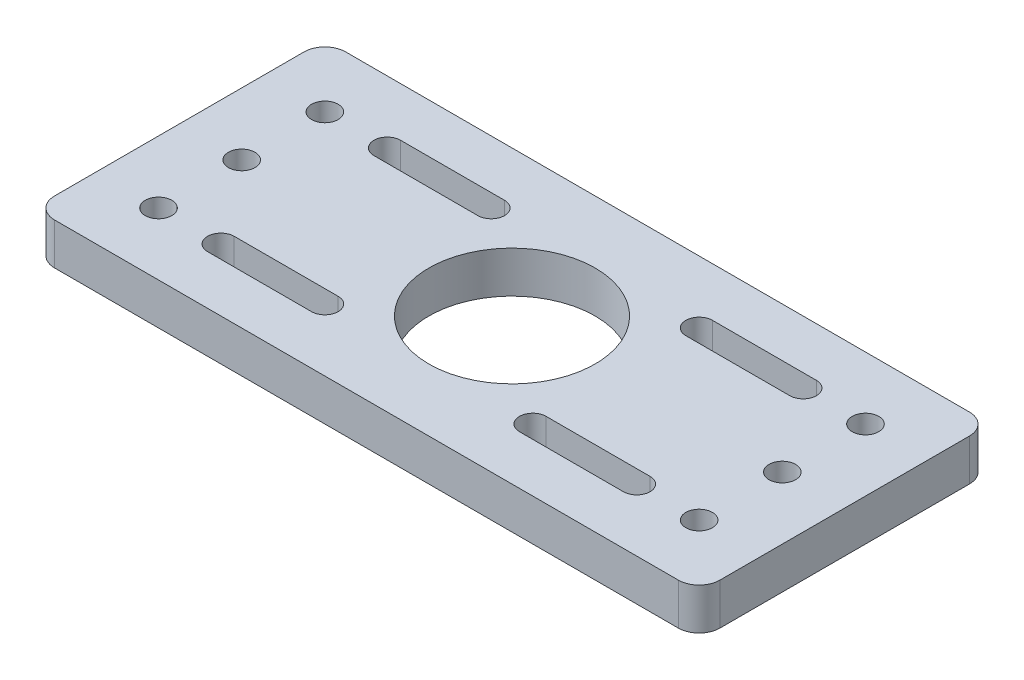
ISO-10303-21;
HEADER;
FILE_DESCRIPTION(('STEP AP214'),'2;1');
FILE_NAME('part.step','',(''),(''),'','','');
FILE_SCHEMA(('AUTOMOTIVE_DESIGN { 1 0 10303 214 1 1 1 1 }'));
ENDSEC;
DATA;
#1=APPLICATION_CONTEXT('core data for automotive mechanical design processes');
#2=APPLICATION_PROTOCOL_DEFINITION('international standard','automotive_design',2000,#1);
#3=PRODUCT_CONTEXT('',#1,'mechanical');
#4=PRODUCT('Part','Part','',(#3));
#5=PRODUCT_RELATED_PRODUCT_CATEGORY('part','',(#4));
#6=PRODUCT_DEFINITION_FORMATION('','',#4);
#7=PRODUCT_DEFINITION_CONTEXT('part definition',#1,'design');
#8=PRODUCT_DEFINITION('design','',#6,#7);
#9=PRODUCT_DEFINITION_SHAPE('','',#8);
#10=(LENGTH_UNIT() NAMED_UNIT(*) SI_UNIT(.MILLI.,.METRE.));
#11=(NAMED_UNIT(*) PLANE_ANGLE_UNIT() SI_UNIT($,.RADIAN.));
#12=(NAMED_UNIT(*) SI_UNIT($,.STERADIAN.) SOLID_ANGLE_UNIT());
#13=UNCERTAINTY_MEASURE_WITH_UNIT(LENGTH_MEASURE(1.E-05),#10,'distance_accuracy_value','');
#14=(GEOMETRIC_REPRESENTATION_CONTEXT(3) GLOBAL_UNCERTAINTY_ASSIGNED_CONTEXT((#13)) GLOBAL_UNIT_ASSIGNED_CONTEXT((#10,
#11,#12)) REPRESENTATION_CONTEXT('',''));
#15=CARTESIAN_POINT('',(0.,0.,0.));
#16=DIRECTION('',(0.,0.,1.));
#17=DIRECTION('',(1.,0.,0.));
#18=AXIS2_PLACEMENT_3D('',#15,#16,#17);
#19=CARTESIAN_POINT('',(0.,12.7,0.));
#20=DIRECTION('',(0.,-1.,0.));
#21=DIRECTION('',(0.,0.,-1.));
#22=AXIS2_PLACEMENT_3D('',#19,#20,#21);
#23=PLANE('',#22);
#24=CARTESIAN_POINT('',(165.1,12.7,-19.05));
#25=DIRECTION('',(0.,1.,0.));
#26=DIRECTION('',(0.,0.,1.));
#27=AXIS2_PLACEMENT_3D('',#24,#25,#26);
#28=CIRCLE('',#27,4.06400000000001);
#29=CARTESIAN_POINT('',(165.1,12.7,-14.986));
#30=VERTEX_POINT('',#29);
#31=CARTESIAN_POINT('',(165.1,12.7,-23.114));
#32=VERTEX_POINT('',#31);
#33=EDGE_CURVE('E262',#30,#32,#28,.T.);
#34=ORIENTED_EDGE('',*,*,#33,.F.);
#35=DIRECTION('',(1.,0.,0.));
#36=VECTOR('',#35,1.);
#37=CARTESIAN_POINT('',(165.1,12.7,-14.986));
#38=LINE('',#37,#36);
#39=CARTESIAN_POINT('',(133.35,12.7,-14.986));
#40=VERTEX_POINT('',#39);
#41=EDGE_CURVE('E273',#40,#30,#38,.T.);
#42=ORIENTED_EDGE('',*,*,#41,.F.);
#43=CARTESIAN_POINT('',(133.35,12.7,-19.05));
#44=DIRECTION('',(0.,1.,0.));
#45=DIRECTION('',(0.,0.,1.));
#46=AXIS2_PLACEMENT_3D('',#43,#44,#45);
#47=CIRCLE('',#46,4.06399999999994);
#48=CARTESIAN_POINT('',(133.35,12.7,-23.1139999999999));
#49=VERTEX_POINT('',#48);
#50=EDGE_CURVE('E269',#49,#40,#47,.T.);
#51=ORIENTED_EDGE('',*,*,#50,.F.);
#52=DIRECTION('',(-1.,0.,0.));
#53=VECTOR('',#52,1.);
#54=CARTESIAN_POINT('',(165.1,12.7,-23.114));
#55=LINE('',#54,#53);
#56=EDGE_CURVE('E265',#32,#49,#55,.T.);
#57=ORIENTED_EDGE('',*,*,#56,.F.);
#58=EDGE_LOOP('',(#34,#42,#51,#57));
#59=FACE_BOUND('',#58,.T.);
#60=CARTESIAN_POINT('',(38.1,12.7,-69.85));
#61=DIRECTION('',(0.,1.,0.));
#62=DIRECTION('',(0.,0.,1.));
#63=AXIS2_PLACEMENT_3D('',#60,#61,#62);
#64=CIRCLE('',#63,4.06400000000001);
#65=CARTESIAN_POINT('',(38.1,12.7,-73.914));
#66=VERTEX_POINT('',#65);
#67=CARTESIAN_POINT('',(38.1,12.7,-65.786));
#68=VERTEX_POINT('',#67);
#69=EDGE_CURVE('E348',#66,#68,#64,.T.);
#70=ORIENTED_EDGE('',*,*,#69,.F.);
#71=DIRECTION('',(-1.,0.,0.));
#72=VECTOR('',#71,1.);
#73=CARTESIAN_POINT('',(38.1,12.7,-73.914));
#74=LINE('',#73,#72);
#75=CARTESIAN_POINT('',(69.85,12.7,-73.914));
#76=VERTEX_POINT('',#75);
#77=EDGE_CURVE('E359',#76,#66,#74,.T.);
#78=ORIENTED_EDGE('',*,*,#77,.F.);
#79=CARTESIAN_POINT('',(69.85,12.7,-69.85));
#80=DIRECTION('',(0.,1.,0.));
#81=DIRECTION('',(0.,0.,1.));
#82=AXIS2_PLACEMENT_3D('',#79,#80,#81);
#83=CIRCLE('',#82,4.06399999999996);
#84=CARTESIAN_POINT('',(69.85,12.7,-65.786));
#85=VERTEX_POINT('',#84);
#86=EDGE_CURVE('E355',#85,#76,#83,.T.);
#87=ORIENTED_EDGE('',*,*,#86,.F.);
#88=DIRECTION('',(1.,0.,0.));
#89=VECTOR('',#88,1.);
#90=CARTESIAN_POINT('',(38.1,12.7,-65.786));
#91=LINE('',#90,#89);
#92=EDGE_CURVE('E351',#68,#85,#91,.T.);
#93=ORIENTED_EDGE('',*,*,#92,.F.);
#94=EDGE_LOOP('',(#70,#78,#87,#93));
#95=FACE_BOUND('',#94,.T.);
#96=DIRECTION('',(-1.,0.,0.));
#97=VECTOR('',#96,1.);
#98=CARTESIAN_POINT('',(0.,12.7,-88.9));
#99=LINE('',#98,#97);
#100=CARTESIAN_POINT('',(196.85,12.7,-88.9));
#101=VERTEX_POINT('',#100);
#102=CARTESIAN_POINT('',(6.35,12.7,-88.9));
#103=VERTEX_POINT('',#102);
#104=EDGE_CURVE('E458',#101,#103,#99,.T.);
#105=ORIENTED_EDGE('',*,*,#104,.T.);
#106=CARTESIAN_POINT('',(6.35,12.7,-82.55));
#107=DIRECTION('',(0.,-1.,0.));
#108=DIRECTION('',(0.,0.,-1.));
#109=AXIS2_PLACEMENT_3D('',#106,#107,#108);
#110=CIRCLE('',#109,6.35);
#111=CARTESIAN_POINT('',(0.,12.7,-82.55));
#112=VERTEX_POINT('',#111);
#113=EDGE_CURVE('E509',#103,#112,#110,.F.);
#114=ORIENTED_EDGE('',*,*,#113,.T.);
#115=DIRECTION('',(0.,0.,1.));
#116=VECTOR('',#115,1.);
#117=CARTESIAN_POINT('',(0.,12.7,0.));
#118=LINE('',#117,#116);
#119=CARTESIAN_POINT('',(0.,12.7,-6.35));
#120=VERTEX_POINT('',#119);
#121=EDGE_CURVE('E447',#112,#120,#118,.T.);
#122=ORIENTED_EDGE('',*,*,#121,.T.);
#123=CARTESIAN_POINT('',(6.35,12.7,-6.35));
#124=DIRECTION('',(0.,-1.,0.));
#125=DIRECTION('',(0.,0.,-1.));
#126=AXIS2_PLACEMENT_3D('',#123,#124,#125);
#127=CIRCLE('',#126,6.35);
#128=CARTESIAN_POINT('',(6.35,12.7,0.));
#129=VERTEX_POINT('',#128);
#130=EDGE_CURVE('E501',#120,#129,#127,.F.);
#131=ORIENTED_EDGE('',*,*,#130,.T.);
#132=DIRECTION('',(1.,0.,0.));
#133=VECTOR('',#132,1.);
#134=CARTESIAN_POINT('',(0.,12.7,0.));
#135=LINE('',#134,#133);
#136=CARTESIAN_POINT('',(196.85,12.7,0.));
#137=VERTEX_POINT('',#136);
#138=EDGE_CURVE('E451',#129,#137,#135,.T.);
#139=ORIENTED_EDGE('',*,*,#138,.T.);
#140=CARTESIAN_POINT('',(196.85,12.7,-6.34999999999997));
#141=DIRECTION('',(0.,-1.,0.));
#142=DIRECTION('',(0.,0.,-1.));
#143=AXIS2_PLACEMENT_3D('',#140,#141,#142);
#144=CIRCLE('',#143,6.35);
#145=CARTESIAN_POINT('',(203.2,12.7,-6.34999999999997));
#146=VERTEX_POINT('',#145);
#147=EDGE_CURVE('E68',#137,#146,#144,.F.);
#148=ORIENTED_EDGE('',*,*,#147,.T.);
#149=DIRECTION('',(0.,0.,-1.));
#150=VECTOR('',#149,1.);
#151=CARTESIAN_POINT('',(203.2,12.7,0.));
#152=LINE('',#151,#150);
#153=CARTESIAN_POINT('',(203.2,12.7,-82.55));
#154=VERTEX_POINT('',#153);
#155=EDGE_CURVE('E455',#146,#154,#152,.T.);
#156=ORIENTED_EDGE('',*,*,#155,.T.);
#157=CARTESIAN_POINT('',(196.85,12.7,-82.55));
#158=DIRECTION('',(0.,-1.,0.));
#159=DIRECTION('',(0.,0.,-1.));
#160=AXIS2_PLACEMENT_3D('',#157,#158,#159);
#161=CIRCLE('',#160,6.35);
#162=EDGE_CURVE('E506',#154,#101,#161,.F.);
#163=ORIENTED_EDGE('',*,*,#162,.T.);
#164=EDGE_LOOP('',(#105,#114,#122,#131,#139,#148,#156,#163));
#165=FACE_BOUND('',#164,.T.);
#166=CARTESIAN_POINT('',(101.6,12.7,-44.45));
#167=DIRECTION('',(0.,1.,0.));
#168=DIRECTION('',(0.,0.,1.));
#169=AXIS2_PLACEMENT_3D('',#166,#167,#168);
#170=CIRCLE('',#169,25.4);
#171=CARTESIAN_POINT('',(101.6,12.7,-19.05));
#172=VERTEX_POINT('',#171);
#173=EDGE_CURVE('E439',#172,#172,#170,.T.);
#174=ORIENTED_EDGE('',*,*,#173,.F.);
#175=EDGE_LOOP('',(#174));
#176=FACE_BOUND('',#175,.T.);
#177=CARTESIAN_POINT('',(19.05,12.7,-19.05));
#178=DIRECTION('',(0.,1.,0.));
#179=DIRECTION('',(0.,0.,1.));
#180=AXIS2_PLACEMENT_3D('',#177,#178,#179);
#181=CIRCLE('',#180,4.064);
#182=CARTESIAN_POINT('',(19.05,12.7,-14.986));
#183=VERTEX_POINT('',#182);
#184=EDGE_CURVE('E431',#183,#183,#181,.T.);
#185=ORIENTED_EDGE('',*,*,#184,.F.);
#186=EDGE_LOOP('',(#185));
#187=FACE_BOUND('',#186,.T.);
#188=CARTESIAN_POINT('',(184.15,12.7,-69.85));
#189=DIRECTION('',(0.,1.,0.));
#190=DIRECTION('',(0.,0.,-1.));
#191=AXIS2_PLACEMENT_3D('',#188,#189,#190);
#192=CIRCLE('',#191,4.06400000000002);
#193=CARTESIAN_POINT('',(184.15,12.7,-73.914));
#194=VERTEX_POINT('',#193);
#195=EDGE_CURVE('E423',#194,#194,#192,.T.);
#196=ORIENTED_EDGE('',*,*,#195,.F.);
#197=EDGE_LOOP('',(#196));
#198=FACE_BOUND('',#197,.T.);
#199=CARTESIAN_POINT('',(19.05,12.7,-44.45));
#200=DIRECTION('',(0.,1.,0.));
#201=DIRECTION('',(0.,0.,1.));
#202=AXIS2_PLACEMENT_3D('',#199,#200,#201);
#203=CIRCLE('',#202,4.064);
#204=CARTESIAN_POINT('',(19.05,12.7,-40.386));
#205=VERTEX_POINT('',#204);
#206=EDGE_CURVE('E415',#205,#205,#203,.T.);
#207=ORIENTED_EDGE('',*,*,#206,.F.);
#208=EDGE_LOOP('',(#207));
#209=FACE_BOUND('',#208,.T.);
#210=CARTESIAN_POINT('',(19.05,12.7,-69.85));
#211=DIRECTION('',(0.,1.,0.));
#212=DIRECTION('',(0.,0.,1.));
#213=AXIS2_PLACEMENT_3D('',#210,#211,#212);
#214=CIRCLE('',#213,4.064);
#215=CARTESIAN_POINT('',(19.05,12.7,-65.786));
#216=VERTEX_POINT('',#215);
#217=EDGE_CURVE('E407',#216,#216,#214,.T.);
#218=ORIENTED_EDGE('',*,*,#217,.F.);
#219=EDGE_LOOP('',(#218));
#220=FACE_BOUND('',#219,.T.);
#221=CARTESIAN_POINT('',(184.15,12.7,-44.45));
#222=DIRECTION('',(0.,1.,0.));
#223=DIRECTION('',(0.,0.,-1.));
#224=AXIS2_PLACEMENT_3D('',#221,#222,#223);
#225=CIRCLE('',#224,4.06400000000001);
#226=CARTESIAN_POINT('',(184.15,12.7,-48.514));
#227=VERTEX_POINT('',#226);
#228=EDGE_CURVE('E399',#227,#227,#225,.T.);
#229=ORIENTED_EDGE('',*,*,#228,.F.);
#230=EDGE_LOOP('',(#229));
#231=FACE_BOUND('',#230,.T.);
#232=CARTESIAN_POINT('',(184.15,12.7,-19.05));
#233=DIRECTION('',(0.,1.,0.));
#234=DIRECTION('',(0.,0.,-1.));
#235=AXIS2_PLACEMENT_3D('',#232,#233,#234);
#236=CIRCLE('',#235,4.06400000000002);
#237=CARTESIAN_POINT('',(184.15,12.7,-23.114));
#238=VERTEX_POINT('',#237);
#239=EDGE_CURVE('E391',#238,#238,#236,.T.);
#240=ORIENTED_EDGE('',*,*,#239,.F.);
#241=EDGE_LOOP('',(#240));
#242=FACE_BOUND('',#241,.T.);
#243=CARTESIAN_POINT('',(38.1,12.7,-19.05));
#244=DIRECTION('',(0.,1.,0.));
#245=DIRECTION('',(0.,0.,-1.));
#246=AXIS2_PLACEMENT_3D('',#243,#244,#245);
#247=CIRCLE('',#246,4.06400000000001);
#248=CARTESIAN_POINT('',(38.1,12.7,-23.114));
#249=VERTEX_POINT('',#248);
#250=CARTESIAN_POINT('',(38.1,12.7,-14.986));
#251=VERTEX_POINT('',#250);
#252=EDGE_CURVE('E305',#249,#251,#247,.T.);
#253=ORIENTED_EDGE('',*,*,#252,.F.);
#254=DIRECTION('',(-1.,0.,0.));
#255=VECTOR('',#254,1.);
#256=CARTESIAN_POINT('',(38.1,12.7,-23.114));
#257=LINE('',#256,#255);
#258=CARTESIAN_POINT('',(69.85,12.7,-23.114));
#259=VERTEX_POINT('',#258);
#260=EDGE_CURVE('E316',#259,#249,#257,.T.);
#261=ORIENTED_EDGE('',*,*,#260,.F.);
#262=CARTESIAN_POINT('',(69.85,12.7,-19.05));
#263=DIRECTION('',(0.,1.,0.));
#264=DIRECTION('',(0.,0.,-1.));
#265=AXIS2_PLACEMENT_3D('',#262,#263,#264);
#266=CIRCLE('',#265,4.06399999999996);
#267=CARTESIAN_POINT('',(69.85,12.7,-14.986));
#268=VERTEX_POINT('',#267);
#269=EDGE_CURVE('E312',#268,#259,#266,.T.);
#270=ORIENTED_EDGE('',*,*,#269,.F.);
#271=DIRECTION('',(1.,0.,0.));
#272=VECTOR('',#271,1.);
#273=CARTESIAN_POINT('',(38.1,12.7,-14.986));
#274=LINE('',#273,#272);
#275=EDGE_CURVE('E308',#251,#268,#274,.T.);
#276=ORIENTED_EDGE('',*,*,#275,.F.);
#277=EDGE_LOOP('',(#253,#261,#270,#276));
#278=FACE_BOUND('',#277,.T.);
#279=CARTESIAN_POINT('',(165.1,12.7,-69.85));
#280=DIRECTION('',(0.,1.,0.));
#281=DIRECTION('',(0.,0.,-1.));
#282=AXIS2_PLACEMENT_3D('',#279,#280,#281);
#283=CIRCLE('',#282,4.06400000000001);
#284=CARTESIAN_POINT('',(165.1,12.7,-65.786));
#285=VERTEX_POINT('',#284);
#286=CARTESIAN_POINT('',(165.1,12.7,-73.914));
#287=VERTEX_POINT('',#286);
#288=EDGE_CURVE('E209',#285,#287,#283,.T.);
#289=ORIENTED_EDGE('',*,*,#288,.F.);
#290=DIRECTION('',(1.,0.,0.));
#291=VECTOR('',#290,1.);
#292=CARTESIAN_POINT('',(165.1,12.7,-65.786));
#293=LINE('',#292,#291);
#294=CARTESIAN_POINT('',(133.35,12.7,-65.7860000000001));
#295=VERTEX_POINT('',#294);
#296=EDGE_CURVE('E238',#295,#285,#293,.T.);
#297=ORIENTED_EDGE('',*,*,#296,.F.);
#298=CARTESIAN_POINT('',(133.35,12.7,-69.85));
#299=DIRECTION('',(0.,1.,0.));
#300=DIRECTION('',(0.,0.,-1.));
#301=AXIS2_PLACEMENT_3D('',#298,#299,#300);
#302=CIRCLE('',#301,4.06399999999994);
#303=CARTESIAN_POINT('',(133.35,12.7,-73.914));
#304=VERTEX_POINT('',#303);
#305=EDGE_CURVE('E234',#304,#295,#302,.T.);
#306=ORIENTED_EDGE('',*,*,#305,.F.);
#307=DIRECTION('',(-1.,0.,0.));
#308=VECTOR('',#307,1.);
#309=CARTESIAN_POINT('',(165.1,12.7,-73.914));
#310=LINE('',#309,#308);
#311=EDGE_CURVE('E220',#287,#304,#310,.T.);
#312=ORIENTED_EDGE('',*,*,#311,.F.);
#313=EDGE_LOOP('',(#289,#297,#306,#312));
#314=FACE_BOUND('',#313,.T.);
#315=ADVANCED_FACE('F45',(#59,#95,#165,#176,#187,#198,#209,#220,#231,#242,#278,#314),#23,.F.);
#316=CARTESIAN_POINT('',(0.,0.,0.));
#317=DIRECTION('',(0.,-1.,0.));
#318=DIRECTION('',(0.,0.,-1.));
#319=AXIS2_PLACEMENT_3D('',#316,#317,#318);
#320=PLANE('',#319);
#321=CARTESIAN_POINT('',(184.15,0.,-44.45));
#322=DIRECTION('',(0.,1.,0.));
#323=DIRECTION('',(0.,0.,-1.));
#324=AXIS2_PLACEMENT_3D('',#321,#322,#323);
#325=CIRCLE('',#324,4.06400000000001);
#326=CARTESIAN_POINT('',(184.15,0.,-48.514));
#327=VERTEX_POINT('',#326);
#328=EDGE_CURVE('E395',#327,#327,#325,.T.);
#329=ORIENTED_EDGE('',*,*,#328,.T.);
#330=EDGE_LOOP('',(#329));
#331=FACE_BOUND('',#330,.T.);
#332=CARTESIAN_POINT('',(19.05,0.,-44.45));
#333=DIRECTION('',(0.,1.,0.));
#334=DIRECTION('',(0.,0.,1.));
#335=AXIS2_PLACEMENT_3D('',#332,#333,#334);
#336=CIRCLE('',#335,4.064);
#337=CARTESIAN_POINT('',(19.05,0.,-40.386));
#338=VERTEX_POINT('',#337);
#339=EDGE_CURVE('E411',#338,#338,#336,.T.);
#340=ORIENTED_EDGE('',*,*,#339,.T.);
#341=EDGE_LOOP('',(#340));
#342=FACE_BOUND('',#341,.T.);
#343=CARTESIAN_POINT('',(19.05,0.,-19.05));
#344=DIRECTION('',(0.,1.,0.));
#345=DIRECTION('',(0.,0.,1.));
#346=AXIS2_PLACEMENT_3D('',#343,#344,#345);
#347=CIRCLE('',#346,4.064);
#348=CARTESIAN_POINT('',(19.05,0.,-14.986));
#349=VERTEX_POINT('',#348);
#350=EDGE_CURVE('E427',#349,#349,#347,.T.);
#351=ORIENTED_EDGE('',*,*,#350,.T.);
#352=EDGE_LOOP('',(#351));
#353=FACE_BOUND('',#352,.T.);
#354=DIRECTION('',(0.,0.,1.));
#355=VECTOR('',#354,1.);
#356=CARTESIAN_POINT('',(0.,0.,0.));
#357=LINE('',#356,#355);
#358=CARTESIAN_POINT('',(0.,0.,-82.55));
#359=VERTEX_POINT('',#358);
#360=CARTESIAN_POINT('',(0.,0.,-6.35));
#361=VERTEX_POINT('',#360);
#362=EDGE_CURVE('E443',#359,#361,#357,.T.);
#363=ORIENTED_EDGE('',*,*,#362,.F.);
#364=CARTESIAN_POINT('',(6.35,0.,-82.55));
#365=DIRECTION('',(0.,-1.,0.));
#366=DIRECTION('',(0.,0.,-1.));
#367=AXIS2_PLACEMENT_3D('',#364,#365,#366);
#368=CIRCLE('',#367,6.35);
#369=CARTESIAN_POINT('',(6.35,0.,-88.9));
#370=VERTEX_POINT('',#369);
#371=EDGE_CURVE('E491',#359,#370,#368,.T.);
#372=ORIENTED_EDGE('',*,*,#371,.T.);
#373=DIRECTION('',(-1.,0.,0.));
#374=VECTOR('',#373,1.);
#375=CARTESIAN_POINT('',(0.,0.,-88.9));
#376=LINE('',#375,#374);
#377=CARTESIAN_POINT('',(196.85,0.,-88.9));
#378=VERTEX_POINT('',#377);
#379=EDGE_CURVE('E452',#378,#370,#376,.T.);
#380=ORIENTED_EDGE('',*,*,#379,.F.);
#381=CARTESIAN_POINT('',(196.85,0.,-82.55));
#382=DIRECTION('',(0.,-1.,0.));
#383=DIRECTION('',(0.,0.,-1.));
#384=AXIS2_PLACEMENT_3D('',#381,#382,#383);
#385=CIRCLE('',#384,6.35);
#386=CARTESIAN_POINT('',(203.2,0.,-82.55));
#387=VERTEX_POINT('',#386);
#388=EDGE_CURVE('E488',#378,#387,#385,.T.);
#389=ORIENTED_EDGE('',*,*,#388,.T.);
#390=DIRECTION('',(0.,0.,-1.));
#391=VECTOR('',#390,1.);
#392=CARTESIAN_POINT('',(203.2,0.,0.));
#393=LINE('',#392,#391);
#394=CARTESIAN_POINT('',(203.2,0.,-6.34999999999997));
#395=VERTEX_POINT('',#394);
#396=EDGE_CURVE('E470',#395,#387,#393,.T.);
#397=ORIENTED_EDGE('',*,*,#396,.F.);
#398=CARTESIAN_POINT('',(196.85,0.,-6.34999999999997));
#399=DIRECTION('',(0.,-1.,0.));
#400=DIRECTION('',(0.,0.,-1.));
#401=AXIS2_PLACEMENT_3D('',#398,#399,#400);
#402=CIRCLE('',#401,6.35);
#403=CARTESIAN_POINT('',(196.85,0.,0.));
#404=VERTEX_POINT('',#403);
#405=EDGE_CURVE('E485',#395,#404,#402,.T.);
#406=ORIENTED_EDGE('',*,*,#405,.T.);
#407=DIRECTION('',(1.,0.,0.));
#408=VECTOR('',#407,1.);
#409=CARTESIAN_POINT('',(0.,0.,0.));
#410=LINE('',#409,#408);
#411=CARTESIAN_POINT('',(6.35,0.,0.));
#412=VERTEX_POINT('',#411);
#413=EDGE_CURVE('E466',#412,#404,#410,.T.);
#414=ORIENTED_EDGE('',*,*,#413,.F.);
#415=CARTESIAN_POINT('',(6.35,0.,-6.35));
#416=DIRECTION('',(0.,-1.,0.));
#417=DIRECTION('',(0.,0.,-1.));
#418=AXIS2_PLACEMENT_3D('',#415,#416,#417);
#419=CIRCLE('',#418,6.35);
#420=EDGE_CURVE('E482',#412,#361,#419,.T.);
#421=ORIENTED_EDGE('',*,*,#420,.T.);
#422=EDGE_LOOP('',(#363,#372,#380,#389,#397,#406,#414,#421));
#423=FACE_BOUND('',#422,.T.);
#424=CARTESIAN_POINT('',(101.6,0.,-44.45));
#425=DIRECTION('',(0.,1.,0.));
#426=DIRECTION('',(0.,0.,1.));
#427=AXIS2_PLACEMENT_3D('',#424,#425,#426);
#428=CIRCLE('',#427,25.4);
#429=CARTESIAN_POINT('',(101.6,0.,-19.05));
#430=VERTEX_POINT('',#429);
#431=EDGE_CURVE('E435',#430,#430,#428,.T.);
#432=ORIENTED_EDGE('',*,*,#431,.T.);
#433=EDGE_LOOP('',(#432));
#434=FACE_BOUND('',#433,.T.);
#435=CARTESIAN_POINT('',(184.15,0.,-69.85));
#436=DIRECTION('',(0.,1.,0.));
#437=DIRECTION('',(0.,0.,-1.));
#438=AXIS2_PLACEMENT_3D('',#435,#436,#437);
#439=CIRCLE('',#438,4.06400000000002);
#440=CARTESIAN_POINT('',(184.15,0.,-73.914));
#441=VERTEX_POINT('',#440);
#442=EDGE_CURVE('E419',#441,#441,#439,.T.);
#443=ORIENTED_EDGE('',*,*,#442,.T.);
#444=EDGE_LOOP('',(#443));
#445=FACE_BOUND('',#444,.T.);
#446=CARTESIAN_POINT('',(19.05,0.,-69.85));
#447=DIRECTION('',(0.,1.,0.));
#448=DIRECTION('',(0.,0.,1.));
#449=AXIS2_PLACEMENT_3D('',#446,#447,#448);
#450=CIRCLE('',#449,4.064);
#451=CARTESIAN_POINT('',(19.05,0.,-65.786));
#452=VERTEX_POINT('',#451);
#453=EDGE_CURVE('E403',#452,#452,#450,.T.);
#454=ORIENTED_EDGE('',*,*,#453,.T.);
#455=EDGE_LOOP('',(#454));
#456=FACE_BOUND('',#455,.T.);
#457=CARTESIAN_POINT('',(184.15,0.,-19.05));
#458=DIRECTION('',(0.,1.,0.));
#459=DIRECTION('',(0.,0.,-1.));
#460=AXIS2_PLACEMENT_3D('',#457,#458,#459);
#461=CIRCLE('',#460,4.06400000000002);
#462=CARTESIAN_POINT('',(184.15,0.,-23.114));
#463=VERTEX_POINT('',#462);
#464=EDGE_CURVE('E390',#463,#463,#461,.T.);
#465=ORIENTED_EDGE('',*,*,#464,.T.);
#466=EDGE_LOOP('',(#465));
#467=FACE_BOUND('',#466,.T.);
#468=DIRECTION('',(-1.,0.,0.));
#469=VECTOR('',#468,1.);
#470=CARTESIAN_POINT('',(38.1,0.,-73.914));
#471=LINE('',#470,#469);
#472=CARTESIAN_POINT('',(69.85,0.,-73.914));
#473=VERTEX_POINT('',#472);
#474=CARTESIAN_POINT('',(38.1,0.,-73.914));
#475=VERTEX_POINT('',#474);
#476=EDGE_CURVE('E352',#473,#475,#471,.T.);
#477=ORIENTED_EDGE('',*,*,#476,.T.);
#478=CARTESIAN_POINT('',(38.1,0.,-69.85));
#479=DIRECTION('',(0.,1.,0.));
#480=DIRECTION('',(0.,0.,1.));
#481=AXIS2_PLACEMENT_3D('',#478,#479,#480);
#482=CIRCLE('',#481,4.06400000000001);
#483=CARTESIAN_POINT('',(38.1,0.,-65.786));
#484=VERTEX_POINT('',#483);
#485=EDGE_CURVE('E347',#475,#484,#482,.T.);
#486=ORIENTED_EDGE('',*,*,#485,.T.);
#487=DIRECTION('',(1.,0.,0.));
#488=VECTOR('',#487,1.);
#489=CARTESIAN_POINT('',(38.1,0.,-65.786));
#490=LINE('',#489,#488);
#491=CARTESIAN_POINT('',(69.85,0.,-65.786));
#492=VERTEX_POINT('',#491);
#493=EDGE_CURVE('E366',#484,#492,#490,.T.);
#494=ORIENTED_EDGE('',*,*,#493,.T.);
#495=CARTESIAN_POINT('',(69.85,0.,-69.85));
#496=DIRECTION('',(0.,1.,0.));
#497=DIRECTION('',(0.,0.,1.));
#498=AXIS2_PLACEMENT_3D('',#495,#496,#497);
#499=CIRCLE('',#498,4.06399999999996);
#500=EDGE_CURVE('E370',#492,#473,#499,.T.);
#501=ORIENTED_EDGE('',*,*,#500,.T.);
#502=EDGE_LOOP('',(#477,#486,#494,#501));
#503=FACE_BOUND('',#502,.T.);
#504=DIRECTION('',(-1.,0.,0.));
#505=VECTOR('',#504,1.);
#506=CARTESIAN_POINT('',(38.1,0.,-23.114));
#507=LINE('',#506,#505);
#508=CARTESIAN_POINT('',(69.85,0.,-23.114));
#509=VERTEX_POINT('',#508);
#510=CARTESIAN_POINT('',(38.1,0.,-23.114));
#511=VERTEX_POINT('',#510);
#512=EDGE_CURVE('E309',#509,#511,#507,.T.);
#513=ORIENTED_EDGE('',*,*,#512,.T.);
#514=CARTESIAN_POINT('',(38.1,0.,-19.05));
#515=DIRECTION('',(0.,1.,0.));
#516=DIRECTION('',(0.,0.,-1.));
#517=AXIS2_PLACEMENT_3D('',#514,#515,#516);
#518=CIRCLE('',#517,4.06400000000001);
#519=CARTESIAN_POINT('',(38.1,0.,-14.986));
#520=VERTEX_POINT('',#519);
#521=EDGE_CURVE('E304',#511,#520,#518,.T.);
#522=ORIENTED_EDGE('',*,*,#521,.T.);
#523=DIRECTION('',(1.,0.,0.));
#524=VECTOR('',#523,1.);
#525=CARTESIAN_POINT('',(38.1,0.,-14.986));
#526=LINE('',#525,#524);
#527=CARTESIAN_POINT('',(69.85,0.,-14.986));
#528=VERTEX_POINT('',#527);
#529=EDGE_CURVE('E323',#520,#528,#526,.T.);
#530=ORIENTED_EDGE('',*,*,#529,.T.);
#531=CARTESIAN_POINT('',(69.85,0.,-19.05));
#532=DIRECTION('',(0.,1.,0.));
#533=DIRECTION('',(0.,0.,-1.));
#534=AXIS2_PLACEMENT_3D('',#531,#532,#533);
#535=CIRCLE('',#534,4.06399999999996);
#536=EDGE_CURVE('E327',#528,#509,#535,.T.);
#537=ORIENTED_EDGE('',*,*,#536,.T.);
#538=EDGE_LOOP('',(#513,#522,#530,#537));
#539=FACE_BOUND('',#538,.T.);
#540=DIRECTION('',(1.,0.,0.));
#541=VECTOR('',#540,1.);
#542=CARTESIAN_POINT('',(165.1,0.,-14.986));
#543=LINE('',#542,#541);
#544=CARTESIAN_POINT('',(133.35,0.,-14.986));
#545=VERTEX_POINT('',#544);
#546=CARTESIAN_POINT('',(165.1,0.,-14.986));
#547=VERTEX_POINT('',#546);
#548=EDGE_CURVE('E266',#545,#547,#543,.T.);
#549=ORIENTED_EDGE('',*,*,#548,.T.);
#550=CARTESIAN_POINT('',(165.1,0.,-19.05));
#551=DIRECTION('',(0.,1.,0.));
#552=DIRECTION('',(0.,0.,1.));
#553=AXIS2_PLACEMENT_3D('',#550,#551,#552);
#554=CIRCLE('',#553,4.06400000000001);
#555=CARTESIAN_POINT('',(165.1,0.,-23.114));
#556=VERTEX_POINT('',#555);
#557=EDGE_CURVE('E229',#547,#556,#554,.T.);
#558=ORIENTED_EDGE('',*,*,#557,.T.);
#559=DIRECTION('',(-1.,0.,0.));
#560=VECTOR('',#559,1.);
#561=CARTESIAN_POINT('',(165.1,0.,-23.114));
#562=LINE('',#561,#560);
#563=CARTESIAN_POINT('',(133.35,0.,-23.1139999999999));
#564=VERTEX_POINT('',#563);
#565=EDGE_CURVE('E280',#556,#564,#562,.T.);
#566=ORIENTED_EDGE('',*,*,#565,.T.);
#567=CARTESIAN_POINT('',(133.35,0.,-19.05));
#568=DIRECTION('',(0.,1.,0.));
#569=DIRECTION('',(0.,0.,1.));
#570=AXIS2_PLACEMENT_3D('',#567,#568,#569);
#571=CIRCLE('',#570,4.06399999999994);
#572=EDGE_CURVE('E284',#564,#545,#571,.T.);
#573=ORIENTED_EDGE('',*,*,#572,.T.);
#574=EDGE_LOOP('',(#549,#558,#566,#573));
#575=FACE_BOUND('',#574,.T.);
#576=DIRECTION('',(1.,0.,0.));
#577=VECTOR('',#576,1.);
#578=CARTESIAN_POINT('',(165.1,0.,-65.786));
#579=LINE('',#578,#577);
#580=CARTESIAN_POINT('',(133.35,0.,-65.7860000000001));
#581=VERTEX_POINT('',#580);
#582=CARTESIAN_POINT('',(165.1,0.,-65.786));
#583=VERTEX_POINT('',#582);
#584=EDGE_CURVE('E221',#581,#583,#579,.T.);
#585=ORIENTED_EDGE('',*,*,#584,.T.);
#586=CARTESIAN_POINT('',(165.1,0.,-69.85));
#587=DIRECTION('',(0.,1.,0.));
#588=DIRECTION('',(0.,0.,-1.));
#589=AXIS2_PLACEMENT_3D('',#586,#587,#588);
#590=CIRCLE('',#589,4.06400000000001);
#591=CARTESIAN_POINT('',(165.1,0.,-73.914));
#592=VERTEX_POINT('',#591);
#593=EDGE_CURVE('E243',#583,#592,#590,.T.);
#594=ORIENTED_EDGE('',*,*,#593,.T.);
#595=DIRECTION('',(-1.,0.,0.));
#596=VECTOR('',#595,1.);
#597=CARTESIAN_POINT('',(165.1,0.,-73.914));
#598=LINE('',#597,#596);
#599=CARTESIAN_POINT('',(133.35,0.,-73.914));
#600=VERTEX_POINT('',#599);
#601=EDGE_CURVE('E227',#592,#600,#598,.T.);
#602=ORIENTED_EDGE('',*,*,#601,.T.);
#603=CARTESIAN_POINT('',(133.35,0.,-69.85));
#604=DIRECTION('',(0.,1.,0.));
#605=DIRECTION('',(0.,0.,-1.));
#606=AXIS2_PLACEMENT_3D('',#603,#604,#605);
#607=CIRCLE('',#606,4.06399999999994);
#608=EDGE_CURVE('E248',#600,#581,#607,.T.);
#609=ORIENTED_EDGE('',*,*,#608,.T.);
#610=EDGE_LOOP('',(#585,#594,#602,#609));
#611=FACE_BOUND('',#610,.T.);
#612=ADVANCED_FACE('F529',(#331,#342,#353,#423,#434,#445,#456,#467,#503,#539,#575,#611),#320,.T.);
#613=CARTESIAN_POINT('',(0.,12.7,0.));
#614=DIRECTION('',(1.,0.,0.));
#615=DIRECTION('',(0.,0.,-1.));
#616=AXIS2_PLACEMENT_3D('',#613,#614,#615);
#617=PLANE('',#616);
#618=ORIENTED_EDGE('',*,*,#121,.F.);
#619=DIRECTION('',(0.,-1.,0.));
#620=VECTOR('',#619,1.);
#621=CARTESIAN_POINT('',(0.,12.7,-82.55));
#622=LINE('',#621,#620);
#623=EDGE_CURVE('E478',#112,#359,#622,.T.);
#624=ORIENTED_EDGE('',*,*,#623,.T.);
#625=ORIENTED_EDGE('',*,*,#362,.T.);
#626=DIRECTION('',(0.,-1.,0.));
#627=VECTOR('',#626,1.);
#628=CARTESIAN_POINT('',(0.,12.7,-6.35));
#629=LINE('',#628,#627);
#630=EDGE_CURVE('E462',#361,#120,#629,.F.);
#631=ORIENTED_EDGE('',*,*,#630,.T.);
#632=EDGE_LOOP('',(#618,#624,#625,#631));
#633=FACE_BOUND('',#632,.T.);
#634=ADVANCED_FACE('F552',(#633),#617,.F.);
#635=CARTESIAN_POINT('',(0.,12.7,0.));
#636=DIRECTION('',(0.,0.,-1.));
#637=DIRECTION('',(-1.,0.,0.));
#638=AXIS2_PLACEMENT_3D('',#635,#636,#637);
#639=PLANE('',#638);
#640=ORIENTED_EDGE('',*,*,#413,.T.);
#641=DIRECTION('',(0.,-1.,0.));
#642=VECTOR('',#641,1.);
#643=CARTESIAN_POINT('',(196.85,12.7,0.));
#644=LINE('',#643,#642);
#645=EDGE_CURVE('E11',#404,#137,#644,.F.);
#646=ORIENTED_EDGE('',*,*,#645,.T.);
#647=ORIENTED_EDGE('',*,*,#138,.F.);
#648=DIRECTION('',(0.,-1.,0.));
#649=VECTOR('',#648,1.);
#650=CARTESIAN_POINT('',(6.35,12.7,0.));
#651=LINE('',#650,#649);
#652=EDGE_CURVE('E54',#129,#412,#651,.T.);
#653=ORIENTED_EDGE('',*,*,#652,.T.);
#654=EDGE_LOOP('',(#640,#646,#647,#653));
#655=FACE_BOUND('',#654,.T.);
#656=ADVANCED_FACE('F523',(#655),#639,.F.);
#657=CARTESIAN_POINT('',(203.2,12.7,0.));
#658=DIRECTION('',(-1.,0.,0.));
#659=DIRECTION('',(0.,0.,1.));
#660=AXIS2_PLACEMENT_3D('',#657,#658,#659);
#661=PLANE('',#660);
#662=ORIENTED_EDGE('',*,*,#396,.T.);
#663=DIRECTION('',(0.,-1.,0.));
#664=VECTOR('',#663,1.);
#665=CARTESIAN_POINT('',(203.2,12.7,-82.55));
#666=LINE('',#665,#664);
#667=EDGE_CURVE('E61',#387,#154,#666,.F.);
#668=ORIENTED_EDGE('',*,*,#667,.T.);
#669=ORIENTED_EDGE('',*,*,#155,.F.);
#670=DIRECTION('',(0.,-1.,0.));
#671=VECTOR('',#670,1.);
#672=CARTESIAN_POINT('',(203.2,12.7,-6.34999999999997));
#673=LINE('',#672,#671);
#674=EDGE_CURVE('E512',#146,#395,#673,.T.);
#675=ORIENTED_EDGE('',*,*,#674,.T.);
#676=EDGE_LOOP('',(#662,#668,#669,#675));
#677=FACE_BOUND('',#676,.T.);
#678=ADVANCED_FACE('F535',(#677),#661,.F.);
#679=CARTESIAN_POINT('',(0.,12.7,-88.9));
#680=DIRECTION('',(0.,0.,1.));
#681=DIRECTION('',(1.,0.,0.));
#682=AXIS2_PLACEMENT_3D('',#679,#680,#681);
#683=PLANE('',#682);
#684=ORIENTED_EDGE('',*,*,#379,.T.);
#685=DIRECTION('',(0.,-1.,0.));
#686=VECTOR('',#685,1.);
#687=CARTESIAN_POINT('',(6.35,12.7,-88.9));
#688=LINE('',#687,#686);
#689=EDGE_CURVE('E498',#370,#103,#688,.F.);
#690=ORIENTED_EDGE('',*,*,#689,.T.);
#691=ORIENTED_EDGE('',*,*,#104,.F.);
#692=DIRECTION('',(0.,-1.,0.));
#693=VECTOR('',#692,1.);
#694=CARTESIAN_POINT('',(196.85,12.7,-88.9));
#695=LINE('',#694,#693);
#696=EDGE_CURVE('E494',#101,#378,#695,.T.);
#697=ORIENTED_EDGE('',*,*,#696,.T.);
#698=EDGE_LOOP('',(#684,#690,#691,#697));
#699=FACE_BOUND('',#698,.T.);
#700=ADVANCED_FACE('F544',(#699),#683,.F.);
#701=CARTESIAN_POINT('',(101.6,12.7,-44.45));
#702=DIRECTION('',(0.,-1.,0.));
#703=DIRECTION('',(0.,0.,-1.));
#704=AXIS2_PLACEMENT_3D('',#701,#702,#703);
#705=CYLINDRICAL_SURFACE('',#704,25.4);
#706=ORIENTED_EDGE('',*,*,#173,.T.);
#707=EDGE_LOOP('',(#706));
#708=FACE_BOUND('',#707,.T.);
#709=ORIENTED_EDGE('',*,*,#431,.F.);
#710=EDGE_LOOP('',(#709));
#711=FACE_BOUND('',#710,.T.);
#712=ADVANCED_FACE('F570',(#708,#711),#705,.F.);
#713=CARTESIAN_POINT('',(19.05,12.7,-19.05));
#714=DIRECTION('',(0.,-1.,0.));
#715=DIRECTION('',(0.,0.,-1.));
#716=AXIS2_PLACEMENT_3D('',#713,#714,#715);
#717=CYLINDRICAL_SURFACE('',#716,4.064);
#718=ORIENTED_EDGE('',*,*,#184,.T.);
#719=EDGE_LOOP('',(#718));
#720=FACE_BOUND('',#719,.T.);
#721=ORIENTED_EDGE('',*,*,#350,.F.);
#722=EDGE_LOOP('',(#721));
#723=FACE_BOUND('',#722,.T.);
#724=ADVANCED_FACE('F787',(#720,#723),#717,.F.);
#725=CARTESIAN_POINT('',(184.15,12.7,-69.85));
#726=DIRECTION('',(0.,-1.,0.));
#727=DIRECTION('',(0.,0.,-1.));
#728=AXIS2_PLACEMENT_3D('',#725,#726,#727);
#729=CYLINDRICAL_SURFACE('',#728,4.06400000000002);
#730=ORIENTED_EDGE('',*,*,#195,.T.);
#731=EDGE_LOOP('',(#730));
#732=FACE_BOUND('',#731,.T.);
#733=ORIENTED_EDGE('',*,*,#442,.F.);
#734=EDGE_LOOP('',(#733));
#735=FACE_BOUND('',#734,.T.);
#736=ADVANCED_FACE('F778',(#732,#735),#729,.F.);
#737=CARTESIAN_POINT('',(19.05,12.7,-44.45));
#738=DIRECTION('',(0.,-1.,0.));
#739=DIRECTION('',(0.,0.,-1.));
#740=AXIS2_PLACEMENT_3D('',#737,#738,#739);
#741=CYLINDRICAL_SURFACE('',#740,4.064);
#742=ORIENTED_EDGE('',*,*,#206,.T.);
#743=EDGE_LOOP('',(#742));
#744=FACE_BOUND('',#743,.T.);
#745=ORIENTED_EDGE('',*,*,#339,.F.);
#746=EDGE_LOOP('',(#745));
#747=FACE_BOUND('',#746,.T.);
#748=ADVANCED_FACE('F769',(#744,#747),#741,.F.);
#749=CARTESIAN_POINT('',(19.05,12.7,-69.85));
#750=DIRECTION('',(0.,-1.,0.));
#751=DIRECTION('',(0.,0.,-1.));
#752=AXIS2_PLACEMENT_3D('',#749,#750,#751);
#753=CYLINDRICAL_SURFACE('',#752,4.064);
#754=ORIENTED_EDGE('',*,*,#217,.T.);
#755=EDGE_LOOP('',(#754));
#756=FACE_BOUND('',#755,.T.);
#757=ORIENTED_EDGE('',*,*,#453,.F.);
#758=EDGE_LOOP('',(#757));
#759=FACE_BOUND('',#758,.T.);
#760=ADVANCED_FACE('F760',(#756,#759),#753,.F.);
#761=CARTESIAN_POINT('',(184.15,12.7,-44.45));
#762=DIRECTION('',(0.,-1.,0.));
#763=DIRECTION('',(0.,0.,-1.));
#764=AXIS2_PLACEMENT_3D('',#761,#762,#763);
#765=CYLINDRICAL_SURFACE('',#764,4.06400000000001);
#766=ORIENTED_EDGE('',*,*,#228,.T.);
#767=EDGE_LOOP('',(#766));
#768=FACE_BOUND('',#767,.T.);
#769=ORIENTED_EDGE('',*,*,#328,.F.);
#770=EDGE_LOOP('',(#769));
#771=FACE_BOUND('',#770,.T.);
#772=ADVANCED_FACE('F751',(#768,#771),#765,.F.);
#773=CARTESIAN_POINT('',(184.15,12.7,-19.05));
#774=DIRECTION('',(0.,-1.,0.));
#775=DIRECTION('',(0.,0.,-1.));
#776=AXIS2_PLACEMENT_3D('',#773,#774,#775);
#777=CYLINDRICAL_SURFACE('',#776,4.06400000000002);
#778=ORIENTED_EDGE('',*,*,#239,.T.);
#779=EDGE_LOOP('',(#778));
#780=FACE_BOUND('',#779,.T.);
#781=ORIENTED_EDGE('',*,*,#464,.F.);
#782=EDGE_LOOP('',(#781));
#783=FACE_BOUND('',#782,.T.);
#784=ADVANCED_FACE('F742',(#780,#783),#777,.F.);
#785=CARTESIAN_POINT('',(38.1,12.7,-69.85));
#786=DIRECTION('',(0.,-1.,0.));
#787=DIRECTION('',(0.,0.,-1.));
#788=AXIS2_PLACEMENT_3D('',#785,#786,#787);
#789=CYLINDRICAL_SURFACE('',#788,4.06400000000001);
#790=ORIENTED_EDGE('',*,*,#485,.F.);
#791=DIRECTION('',(0.,-1.,0.));
#792=VECTOR('',#791,1.);
#793=CARTESIAN_POINT('',(38.1,12.7,-73.914));
#794=LINE('',#793,#792);
#795=EDGE_CURVE('E362',#66,#475,#794,.T.);
#796=ORIENTED_EDGE('',*,*,#795,.F.);
#797=ORIENTED_EDGE('',*,*,#69,.T.);
#798=DIRECTION('',(0.,-1.,0.));
#799=VECTOR('',#798,1.);
#800=CARTESIAN_POINT('',(38.1,12.7,-65.786));
#801=LINE('',#800,#799);
#802=EDGE_CURVE('E386',#68,#484,#801,.T.);
#803=ORIENTED_EDGE('',*,*,#802,.T.);
#804=EDGE_LOOP('',(#790,#796,#797,#803));
#805=FACE_BOUND('',#804,.T.);
#806=ADVANCED_FACE('F733',(#805),#789,.F.);
#807=CARTESIAN_POINT('',(38.1,12.7,-65.786));
#808=DIRECTION('',(0.,0.,-1.));
#809=DIRECTION('',(-1.,0.,0.));
#810=AXIS2_PLACEMENT_3D('',#807,#808,#809);
#811=PLANE('',#810);
#812=ORIENTED_EDGE('',*,*,#493,.F.);
#813=ORIENTED_EDGE('',*,*,#802,.F.);
#814=ORIENTED_EDGE('',*,*,#92,.T.);
#815=DIRECTION('',(0.,-1.,0.));
#816=VECTOR('',#815,1.);
#817=CARTESIAN_POINT('',(69.85,12.7,-65.786));
#818=LINE('',#817,#816);
#819=EDGE_CURVE('E383',#85,#492,#818,.T.);
#820=ORIENTED_EDGE('',*,*,#819,.T.);
#821=EDGE_LOOP('',(#812,#813,#814,#820));
#822=FACE_BOUND('',#821,.T.);
#823=ADVANCED_FACE('F724',(#822),#811,.T.);
#824=CARTESIAN_POINT('',(69.85,12.7,-69.85));
#825=DIRECTION('',(0.,-1.,0.));
#826=DIRECTION('',(0.,0.,-1.));
#827=AXIS2_PLACEMENT_3D('',#824,#825,#826);
#828=CYLINDRICAL_SURFACE('',#827,4.06399999999996);
#829=ORIENTED_EDGE('',*,*,#500,.F.);
#830=ORIENTED_EDGE('',*,*,#819,.F.);
#831=ORIENTED_EDGE('',*,*,#86,.T.);
#832=DIRECTION('',(0.,-1.,0.));
#833=VECTOR('',#832,1.);
#834=CARTESIAN_POINT('',(69.85,12.7,-73.914));
#835=LINE('',#834,#833);
#836=EDGE_CURVE('E380',#76,#473,#835,.T.);
#837=ORIENTED_EDGE('',*,*,#836,.T.);
#838=EDGE_LOOP('',(#829,#830,#831,#837));
#839=FACE_BOUND('',#838,.T.);
#840=ADVANCED_FACE('F715',(#839),#828,.F.);
#841=CARTESIAN_POINT('',(38.1,12.7,-73.914));
#842=DIRECTION('',(0.,0.,1.));
#843=DIRECTION('',(1.,0.,0.));
#844=AXIS2_PLACEMENT_3D('',#841,#842,#843);
#845=PLANE('',#844);
#846=ORIENTED_EDGE('',*,*,#476,.F.);
#847=ORIENTED_EDGE('',*,*,#836,.F.);
#848=ORIENTED_EDGE('',*,*,#77,.T.);
#849=ORIENTED_EDGE('',*,*,#795,.T.);
#850=EDGE_LOOP('',(#846,#847,#848,#849));
#851=FACE_BOUND('',#850,.T.);
#852=ADVANCED_FACE('F706',(#851),#845,.T.);
#853=CARTESIAN_POINT('',(38.1,12.7,-19.05));
#854=DIRECTION('',(0.,-1.,0.));
#855=DIRECTION('',(0.,0.,-1.));
#856=AXIS2_PLACEMENT_3D('',#853,#854,#855);
#857=CYLINDRICAL_SURFACE('',#856,4.06400000000001);
#858=ORIENTED_EDGE('',*,*,#521,.F.);
#859=DIRECTION('',(0.,-1.,0.));
#860=VECTOR('',#859,1.);
#861=CARTESIAN_POINT('',(38.1,12.7,-23.114));
#862=LINE('',#861,#860);
#863=EDGE_CURVE('E319',#249,#511,#862,.T.);
#864=ORIENTED_EDGE('',*,*,#863,.F.);
#865=ORIENTED_EDGE('',*,*,#252,.T.);
#866=DIRECTION('',(0.,-1.,0.));
#867=VECTOR('',#866,1.);
#868=CARTESIAN_POINT('',(38.1,12.7,-14.986));
#869=LINE('',#868,#867);
#870=EDGE_CURVE('E343',#251,#520,#869,.T.);
#871=ORIENTED_EDGE('',*,*,#870,.T.);
#872=EDGE_LOOP('',(#858,#864,#865,#871));
#873=FACE_BOUND('',#872,.T.);
#874=ADVANCED_FACE('F697',(#873),#857,.F.);
#875=CARTESIAN_POINT('',(38.1,12.7,-14.986));
#876=DIRECTION('',(0.,0.,-1.));
#877=DIRECTION('',(-1.,0.,0.));
#878=AXIS2_PLACEMENT_3D('',#875,#876,#877);
#879=PLANE('',#878);
#880=ORIENTED_EDGE('',*,*,#529,.F.);
#881=ORIENTED_EDGE('',*,*,#870,.F.);
#882=ORIENTED_EDGE('',*,*,#275,.T.);
#883=DIRECTION('',(0.,-1.,0.));
#884=VECTOR('',#883,1.);
#885=CARTESIAN_POINT('',(69.85,12.7,-14.986));
#886=LINE('',#885,#884);
#887=EDGE_CURVE('E340',#268,#528,#886,.T.);
#888=ORIENTED_EDGE('',*,*,#887,.T.);
#889=EDGE_LOOP('',(#880,#881,#882,#888));
#890=FACE_BOUND('',#889,.T.);
#891=ADVANCED_FACE('F688',(#890),#879,.T.);
#892=CARTESIAN_POINT('',(69.85,12.7,-19.05));
#893=DIRECTION('',(0.,-1.,0.));
#894=DIRECTION('',(0.,0.,-1.));
#895=AXIS2_PLACEMENT_3D('',#892,#893,#894);
#896=CYLINDRICAL_SURFACE('',#895,4.06399999999996);
#897=ORIENTED_EDGE('',*,*,#536,.F.);
#898=ORIENTED_EDGE('',*,*,#887,.F.);
#899=ORIENTED_EDGE('',*,*,#269,.T.);
#900=DIRECTION('',(0.,-1.,0.));
#901=VECTOR('',#900,1.);
#902=CARTESIAN_POINT('',(69.85,12.7,-23.114));
#903=LINE('',#902,#901);
#904=EDGE_CURVE('E337',#259,#509,#903,.T.);
#905=ORIENTED_EDGE('',*,*,#904,.T.);
#906=EDGE_LOOP('',(#897,#898,#899,#905));
#907=FACE_BOUND('',#906,.T.);
#908=ADVANCED_FACE('F679',(#907),#896,.F.);
#909=CARTESIAN_POINT('',(38.1,12.7,-23.114));
#910=DIRECTION('',(0.,0.,1.));
#911=DIRECTION('',(1.,0.,0.));
#912=AXIS2_PLACEMENT_3D('',#909,#910,#911);
#913=PLANE('',#912);
#914=ORIENTED_EDGE('',*,*,#512,.F.);
#915=ORIENTED_EDGE('',*,*,#904,.F.);
#916=ORIENTED_EDGE('',*,*,#260,.T.);
#917=ORIENTED_EDGE('',*,*,#863,.T.);
#918=EDGE_LOOP('',(#914,#915,#916,#917));
#919=FACE_BOUND('',#918,.T.);
#920=ADVANCED_FACE('F670',(#919),#913,.T.);
#921=CARTESIAN_POINT('',(165.1,12.7,-19.05));
#922=DIRECTION('',(0.,-1.,0.));
#923=DIRECTION('',(0.,0.,-1.));
#924=AXIS2_PLACEMENT_3D('',#921,#922,#923);
#925=CYLINDRICAL_SURFACE('',#924,4.06400000000001);
#926=ORIENTED_EDGE('',*,*,#557,.F.);
#927=DIRECTION('',(0.,-1.,0.));
#928=VECTOR('',#927,1.);
#929=CARTESIAN_POINT('',(165.1,12.7,-14.986));
#930=LINE('',#929,#928);
#931=EDGE_CURVE('E276',#30,#547,#930,.T.);
#932=ORIENTED_EDGE('',*,*,#931,.F.);
#933=ORIENTED_EDGE('',*,*,#33,.T.);
#934=DIRECTION('',(0.,-1.,0.));
#935=VECTOR('',#934,1.);
#936=CARTESIAN_POINT('',(165.1,12.7,-23.114));
#937=LINE('',#936,#935);
#938=EDGE_CURVE('E300',#32,#556,#937,.T.);
#939=ORIENTED_EDGE('',*,*,#938,.T.);
#940=EDGE_LOOP('',(#926,#932,#933,#939));
#941=FACE_BOUND('',#940,.T.);
#942=ADVANCED_FACE('F661',(#941),#925,.F.);
#943=CARTESIAN_POINT('',(165.1,12.7,-23.114));
#944=DIRECTION('',(0.,0.,1.));
#945=DIRECTION('',(1.,0.,0.));
#946=AXIS2_PLACEMENT_3D('',#943,#944,#945);
#947=PLANE('',#946);
#948=ORIENTED_EDGE('',*,*,#565,.F.);
#949=ORIENTED_EDGE('',*,*,#938,.F.);
#950=ORIENTED_EDGE('',*,*,#56,.T.);
#951=DIRECTION('',(0.,-1.,0.));
#952=VECTOR('',#951,1.);
#953=CARTESIAN_POINT('',(133.35,12.7,-23.1139999999999));
#954=LINE('',#953,#952);
#955=EDGE_CURVE('E297',#49,#564,#954,.T.);
#956=ORIENTED_EDGE('',*,*,#955,.T.);
#957=EDGE_LOOP('',(#948,#949,#950,#956));
#958=FACE_BOUND('',#957,.T.);
#959=ADVANCED_FACE('F652',(#958),#947,.T.);
#960=CARTESIAN_POINT('',(133.35,12.7,-19.05));
#961=DIRECTION('',(0.,-1.,0.));
#962=DIRECTION('',(0.,0.,-1.));
#963=AXIS2_PLACEMENT_3D('',#960,#961,#962);
#964=CYLINDRICAL_SURFACE('',#963,4.06399999999994);
#965=ORIENTED_EDGE('',*,*,#572,.F.);
#966=ORIENTED_EDGE('',*,*,#955,.F.);
#967=ORIENTED_EDGE('',*,*,#50,.T.);
#968=DIRECTION('',(0.,-1.,0.));
#969=VECTOR('',#968,1.);
#970=CARTESIAN_POINT('',(133.35,12.7,-14.986));
#971=LINE('',#970,#969);
#972=EDGE_CURVE('E294',#40,#545,#971,.T.);
#973=ORIENTED_EDGE('',*,*,#972,.T.);
#974=EDGE_LOOP('',(#965,#966,#967,#973));
#975=FACE_BOUND('',#974,.T.);
#976=ADVANCED_FACE('F643',(#975),#964,.F.);
#977=CARTESIAN_POINT('',(165.1,12.7,-14.986));
#978=DIRECTION('',(0.,0.,-1.));
#979=DIRECTION('',(-1.,0.,0.));
#980=AXIS2_PLACEMENT_3D('',#977,#978,#979);
#981=PLANE('',#980);
#982=ORIENTED_EDGE('',*,*,#548,.F.);
#983=ORIENTED_EDGE('',*,*,#972,.F.);
#984=ORIENTED_EDGE('',*,*,#41,.T.);
#985=ORIENTED_EDGE('',*,*,#931,.T.);
#986=EDGE_LOOP('',(#982,#983,#984,#985));
#987=FACE_BOUND('',#986,.T.);
#988=ADVANCED_FACE('F635',(#987),#981,.T.);
#989=CARTESIAN_POINT('',(165.1,12.7,-69.85));
#990=DIRECTION('',(0.,-1.,0.));
#991=DIRECTION('',(0.,0.,-1.));
#992=AXIS2_PLACEMENT_3D('',#989,#990,#991);
#993=CYLINDRICAL_SURFACE('',#992,4.06400000000001);
#994=ORIENTED_EDGE('',*,*,#593,.F.);
#995=DIRECTION('',(0.,-1.,0.));
#996=VECTOR('',#995,1.);
#997=CARTESIAN_POINT('',(165.1,12.7,-65.786));
#998=LINE('',#997,#996);
#999=EDGE_CURVE('E215',#285,#583,#998,.T.);
#1000=ORIENTED_EDGE('',*,*,#999,.F.);
#1001=ORIENTED_EDGE('',*,*,#288,.T.);
#1002=DIRECTION('',(0.,-1.,0.));
#1003=VECTOR('',#1002,1.);
#1004=CARTESIAN_POINT('',(165.1,12.7,-73.914));
#1005=LINE('',#1004,#1003);
#1006=EDGE_CURVE('E212',#287,#592,#1005,.T.);
#1007=ORIENTED_EDGE('',*,*,#1006,.T.);
#1008=EDGE_LOOP('',(#994,#1000,#1001,#1007));
#1009=FACE_BOUND('',#1008,.T.);
#1010=ADVANCED_FACE('F211',(#1009),#993,.F.);
#1011=CARTESIAN_POINT('',(165.1,12.7,-73.914));
#1012=DIRECTION('',(0.,0.,1.));
#1013=DIRECTION('',(1.,0.,0.));
#1014=AXIS2_PLACEMENT_3D('',#1011,#1012,#1013);
#1015=PLANE('',#1014);
#1016=ORIENTED_EDGE('',*,*,#601,.F.);
#1017=ORIENTED_EDGE('',*,*,#1006,.F.);
#1018=ORIENTED_EDGE('',*,*,#311,.T.);
#1019=DIRECTION('',(0.,-1.,0.));
#1020=VECTOR('',#1019,1.);
#1021=CARTESIAN_POINT('',(133.35,12.7,-73.914));
#1022=LINE('',#1021,#1020);
#1023=EDGE_CURVE('E230',#304,#600,#1022,.T.);
#1024=ORIENTED_EDGE('',*,*,#1023,.T.);
#1025=EDGE_LOOP('',(#1016,#1017,#1018,#1024));
#1026=FACE_BOUND('',#1025,.T.);
#1027=ADVANCED_FACE('F224',(#1026),#1015,.T.);
#1028=CARTESIAN_POINT('',(133.35,12.7,-69.85));
#1029=DIRECTION('',(0.,-1.,0.));
#1030=DIRECTION('',(0.,0.,-1.));
#1031=AXIS2_PLACEMENT_3D('',#1028,#1029,#1030);
#1032=CYLINDRICAL_SURFACE('',#1031,4.06399999999994);
#1033=ORIENTED_EDGE('',*,*,#608,.F.);
#1034=ORIENTED_EDGE('',*,*,#1023,.F.);
#1035=ORIENTED_EDGE('',*,*,#305,.T.);
#1036=DIRECTION('',(0.,-1.,0.));
#1037=VECTOR('',#1036,1.);
#1038=CARTESIAN_POINT('',(133.35,12.7,-65.7860000000001));
#1039=LINE('',#1038,#1037);
#1040=EDGE_CURVE('E257',#295,#581,#1039,.T.);
#1041=ORIENTED_EDGE('',*,*,#1040,.T.);
#1042=EDGE_LOOP('',(#1033,#1034,#1035,#1041));
#1043=FACE_BOUND('',#1042,.T.);
#1044=ADVANCED_FACE('F611',(#1043),#1032,.F.);
#1045=CARTESIAN_POINT('',(165.1,12.7,-65.786));
#1046=DIRECTION('',(0.,0.,-1.));
#1047=DIRECTION('',(-1.,0.,0.));
#1048=AXIS2_PLACEMENT_3D('',#1045,#1046,#1047);
#1049=PLANE('',#1048);
#1050=ORIENTED_EDGE('',*,*,#584,.F.);
#1051=ORIENTED_EDGE('',*,*,#1040,.F.);
#1052=ORIENTED_EDGE('',*,*,#296,.T.);
#1053=ORIENTED_EDGE('',*,*,#999,.T.);
#1054=EDGE_LOOP('',(#1050,#1051,#1052,#1053));
#1055=FACE_BOUND('',#1054,.T.);
#1056=ADVANCED_FACE('F583',(#1055),#1049,.T.);
#1057=CARTESIAN_POINT('',(6.35,12.7,-82.55));
#1058=DIRECTION('',(0.,-1.,0.));
#1059=DIRECTION('',(0.,0.,-1.));
#1060=AXIS2_PLACEMENT_3D('',#1057,#1058,#1059);
#1061=CYLINDRICAL_SURFACE('',#1060,6.35);
#1062=ORIENTED_EDGE('',*,*,#113,.F.);
#1063=ORIENTED_EDGE('',*,*,#689,.F.);
#1064=ORIENTED_EDGE('',*,*,#371,.F.);
#1065=ORIENTED_EDGE('',*,*,#623,.F.);
#1066=EDGE_LOOP('',(#1062,#1063,#1064,#1065));
#1067=FACE_BOUND('',#1066,.T.);
#1068=ADVANCED_FACE('F549',(#1067),#1061,.T.);
#1069=CARTESIAN_POINT('',(196.85,12.7,-82.55));
#1070=DIRECTION('',(0.,-1.,0.));
#1071=DIRECTION('',(0.,0.,-1.));
#1072=AXIS2_PLACEMENT_3D('',#1069,#1070,#1071);
#1073=CYLINDRICAL_SURFACE('',#1072,6.35);
#1074=ORIENTED_EDGE('',*,*,#162,.F.);
#1075=ORIENTED_EDGE('',*,*,#667,.F.);
#1076=ORIENTED_EDGE('',*,*,#388,.F.);
#1077=ORIENTED_EDGE('',*,*,#696,.F.);
#1078=EDGE_LOOP('',(#1074,#1075,#1076,#1077));
#1079=FACE_BOUND('',#1078,.T.);
#1080=ADVANCED_FACE('F541',(#1079),#1073,.T.);
#1081=CARTESIAN_POINT('',(196.85,12.7,-6.34999999999997));
#1082=DIRECTION('',(0.,-1.,0.));
#1083=DIRECTION('',(0.,0.,-1.));
#1084=AXIS2_PLACEMENT_3D('',#1081,#1082,#1083);
#1085=CYLINDRICAL_SURFACE('',#1084,6.35);
#1086=ORIENTED_EDGE('',*,*,#147,.F.);
#1087=ORIENTED_EDGE('',*,*,#645,.F.);
#1088=ORIENTED_EDGE('',*,*,#405,.F.);
#1089=ORIENTED_EDGE('',*,*,#674,.F.);
#1090=EDGE_LOOP('',(#1086,#1087,#1088,#1089));
#1091=FACE_BOUND('',#1090,.T.);
#1092=ADVANCED_FACE('F534',(#1091),#1085,.T.);
#1093=CARTESIAN_POINT('',(6.35,12.7,-6.35));
#1094=DIRECTION('',(0.,-1.,0.));
#1095=DIRECTION('',(0.,0.,-1.));
#1096=AXIS2_PLACEMENT_3D('',#1093,#1094,#1095);
#1097=CYLINDRICAL_SURFACE('',#1096,6.35);
#1098=ORIENTED_EDGE('',*,*,#130,.F.);
#1099=ORIENTED_EDGE('',*,*,#630,.F.);
#1100=ORIENTED_EDGE('',*,*,#420,.F.);
#1101=ORIENTED_EDGE('',*,*,#652,.F.);
#1102=EDGE_LOOP('',(#1098,#1099,#1100,#1101));
#1103=FACE_BOUND('',#1102,.T.);
#1104=ADVANCED_FACE('F47',(#1103),#1097,.T.);
#1105=CLOSED_SHELL('',(#315,#612,#634,#656,#678,#700,#712,#724,#736,#748,#760,#772,#784,#806,
#823,#840,#852,#874,#891,#908,#920,#942,#959,#976,#988,#1010,#1027,#1044,#1056,#1068,#1080,
#1092,#1104));
#1106=MANIFOLD_SOLID_BREP('B2',#1105);
#1107=ADVANCED_BREP_SHAPE_REPRESENTATION('',(#18,#1106),#14);
#1108=SHAPE_DEFINITION_REPRESENTATION(#9,#1107);
ENDSEC;
END-ISO-10303-21;
